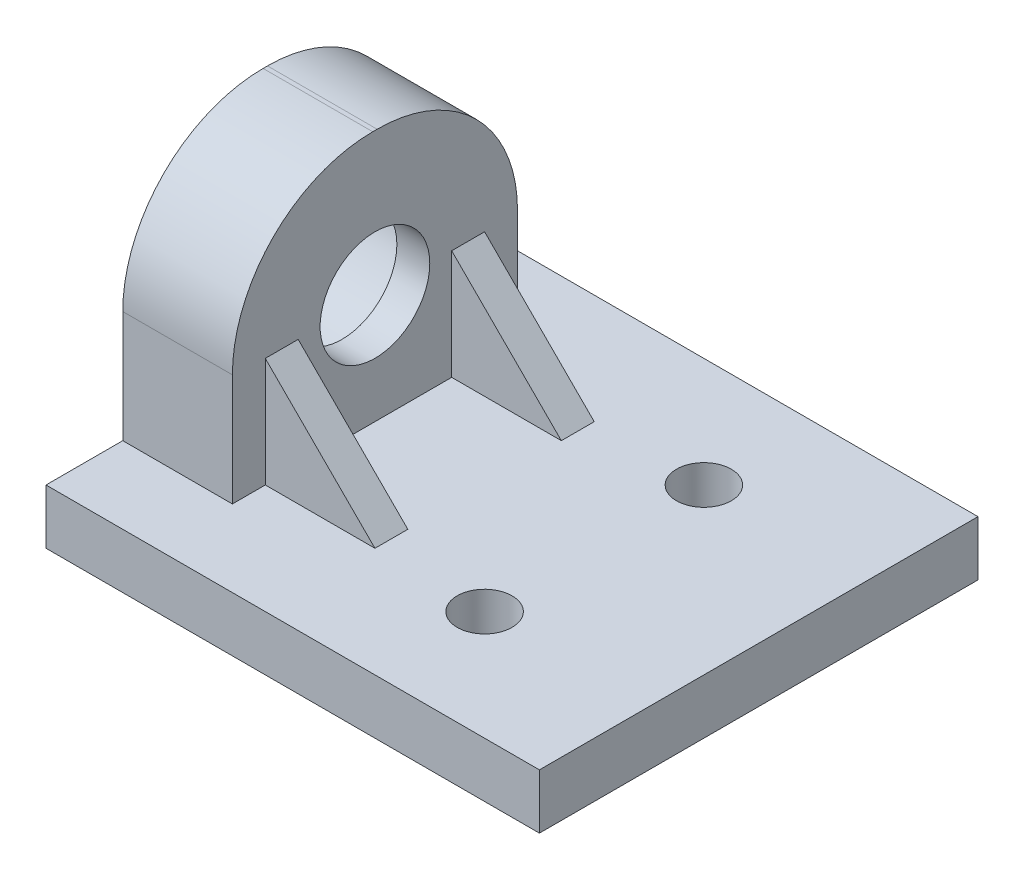
ISO-10303-21;
HEADER;
FILE_DESCRIPTION(('STEP AP214'),'2;1');
FILE_NAME('part.step','',(''),(''),'','','');
FILE_SCHEMA(('AUTOMOTIVE_DESIGN { 1 0 10303 214 1 1 1 1 }'));
ENDSEC;
DATA;
#1=APPLICATION_CONTEXT('core data for automotive mechanical design processes');
#2=APPLICATION_PROTOCOL_DEFINITION('international standard','automotive_design',2000,#1);
#3=PRODUCT_CONTEXT('',#1,'mechanical');
#4=PRODUCT('Part','Part','',(#3));
#5=PRODUCT_RELATED_PRODUCT_CATEGORY('part','',(#4));
#6=PRODUCT_DEFINITION_FORMATION('','',#4);
#7=PRODUCT_DEFINITION_CONTEXT('part definition',#1,'design');
#8=PRODUCT_DEFINITION('design','',#6,#7);
#9=PRODUCT_DEFINITION_SHAPE('','',#8);
#10=(LENGTH_UNIT() NAMED_UNIT(*) SI_UNIT(.MILLI.,.METRE.));
#11=(NAMED_UNIT(*) PLANE_ANGLE_UNIT() SI_UNIT($,.RADIAN.));
#12=(NAMED_UNIT(*) SI_UNIT($,.STERADIAN.) SOLID_ANGLE_UNIT());
#13=UNCERTAINTY_MEASURE_WITH_UNIT(LENGTH_MEASURE(1.E-05),#10,'distance_accuracy_value','');
#14=(GEOMETRIC_REPRESENTATION_CONTEXT(3) GLOBAL_UNCERTAINTY_ASSIGNED_CONTEXT((#13)) GLOBAL_UNIT_ASSIGNED_CONTEXT((#10,
#11,#12)) REPRESENTATION_CONTEXT('',''));
#15=CARTESIAN_POINT('',(0.,0.,0.));
#16=DIRECTION('',(0.,0.,1.));
#17=DIRECTION('',(1.,0.,0.));
#18=AXIS2_PLACEMENT_3D('',#15,#16,#17);
#19=CARTESIAN_POINT('',(0.,25.4,0.));
#20=DIRECTION('',(0.,-1.,0.));
#21=DIRECTION('',(0.,0.,-1.));
#22=AXIS2_PLACEMENT_3D('',#19,#20,#21);
#23=PLANE('',#22);
#24=CARTESIAN_POINT('',(38.1,25.4,-38.1));
#25=DIRECTION('',(0.,-1.,0.));
#26=DIRECTION('',(0.,0.,-1.));
#27=AXIS2_PLACEMENT_3D('',#24,#25,#26);
#28=CIRCLE('',#27,3.175);
#29=CARTESIAN_POINT('',(38.1,25.4,-41.275));
#30=VERTEX_POINT('',#29);
#31=EDGE_CURVE('E222',#30,#30,#28,.T.);
#32=ORIENTED_EDGE('',*,*,#31,.T.);
#33=EDGE_LOOP('',(#32));
#34=FACE_BOUND('',#33,.T.);
#35=CARTESIAN_POINT('',(38.1,25.4,-12.7));
#36=DIRECTION('',(0.,-1.,0.));
#37=DIRECTION('',(0.,0.,-1.));
#38=AXIS2_PLACEMENT_3D('',#35,#36,#37);
#39=CIRCLE('',#38,3.175);
#40=CARTESIAN_POINT('',(38.1,25.4,-15.875));
#41=VERTEX_POINT('',#40);
#42=EDGE_CURVE('E201',#41,#41,#39,.T.);
#43=ORIENTED_EDGE('',*,*,#42,.T.);
#44=EDGE_LOOP('',(#43));
#45=FACE_BOUND('',#44,.T.);
#46=DIRECTION('',(-1.,0.,0.));
#47=VECTOR('',#46,1.);
#48=CARTESIAN_POINT('',(0.,25.4,-50.8));
#49=LINE('',#48,#47);
#50=CARTESIAN_POINT('',(57.15,25.4,-50.8));
#51=VERTEX_POINT('',#50);
#52=CARTESIAN_POINT('',(0.,25.4,-50.8));
#53=VERTEX_POINT('',#52);
#54=EDGE_CURVE('E184',#51,#53,#49,.T.);
#55=ORIENTED_EDGE('',*,*,#54,.T.);
#56=DIRECTION('',(0.,0.,1.));
#57=VECTOR('',#56,1.);
#58=CARTESIAN_POINT('',(0.,25.4,0.));
#59=LINE('',#58,#57);
#60=CARTESIAN_POINT('',(0.,25.4,-41.91));
#61=VERTEX_POINT('',#60);
#62=EDGE_CURVE('E182',#53,#61,#59,.T.);
#63=ORIENTED_EDGE('',*,*,#62,.T.);
#64=DIRECTION('',(-1.,0.,0.));
#65=VECTOR('',#64,1.);
#66=CARTESIAN_POINT('',(12.7,25.4,-41.91));
#67=LINE('',#66,#65);
#68=CARTESIAN_POINT('',(12.7,25.4,-41.91));
#69=VERTEX_POINT('',#68);
#70=EDGE_CURVE('E265',#69,#61,#67,.T.);
#71=ORIENTED_EDGE('',*,*,#70,.F.);
#72=DIRECTION('',(0.,0.,1.));
#73=VECTOR('',#72,1.);
#74=CARTESIAN_POINT('',(12.7,25.4,-41.91));
#75=LINE('',#74,#73);
#76=CARTESIAN_POINT('',(12.7,25.4,-38.1));
#77=VERTEX_POINT('',#76);
#78=EDGE_CURVE('E244',#69,#77,#75,.T.);
#79=ORIENTED_EDGE('',*,*,#78,.T.);
#80=DIRECTION('',(-1.,0.,0.));
#81=VECTOR('',#80,1.);
#82=CARTESIAN_POINT('',(12.7,25.4,-38.1));
#83=LINE('',#82,#81);
#84=CARTESIAN_POINT('',(25.4,25.4,-38.1));
#85=VERTEX_POINT('',#84);
#86=EDGE_CURVE('E595',#85,#77,#83,.T.);
#87=ORIENTED_EDGE('',*,*,#86,.F.);
#88=DIRECTION('',(0.,0.,-1.));
#89=VECTOR('',#88,1.);
#90=CARTESIAN_POINT('',(25.4,25.4,-34.29));
#91=LINE('',#90,#89);
#92=CARTESIAN_POINT('',(25.4,25.4,-34.29));
#93=VERTEX_POINT('',#92);
#94=EDGE_CURVE('E598',#93,#85,#91,.T.);
#95=ORIENTED_EDGE('',*,*,#94,.F.);
#96=DIRECTION('',(1.,0.,0.));
#97=VECTOR('',#96,1.);
#98=CARTESIAN_POINT('',(12.7,25.4,-34.29));
#99=LINE('',#98,#97);
#100=CARTESIAN_POINT('',(12.7,25.4,-34.29));
#101=VERTEX_POINT('',#100);
#102=EDGE_CURVE('E577',#101,#93,#99,.T.);
#103=ORIENTED_EDGE('',*,*,#102,.F.);
#104=CARTESIAN_POINT('',(12.7,25.4,-16.51));
#105=VERTEX_POINT('',#104);
#106=EDGE_CURVE('E249',#101,#105,#75,.T.);
#107=ORIENTED_EDGE('',*,*,#106,.T.);
#108=DIRECTION('',(-1.,0.,0.));
#109=VECTOR('',#108,1.);
#110=CARTESIAN_POINT('',(12.7,25.4,-16.51));
#111=LINE('',#110,#109);
#112=CARTESIAN_POINT('',(25.4,25.4,-16.51));
#113=VERTEX_POINT('',#112);
#114=EDGE_CURVE('E563',#113,#105,#111,.T.);
#115=ORIENTED_EDGE('',*,*,#114,.F.);
#116=DIRECTION('',(0.,0.,-1.));
#117=VECTOR('',#116,1.);
#118=CARTESIAN_POINT('',(25.4,25.4,-16.51));
#119=LINE('',#118,#117);
#120=CARTESIAN_POINT('',(25.4,25.4,-12.7));
#121=VERTEX_POINT('',#120);
#122=EDGE_CURVE('E558',#121,#113,#119,.T.);
#123=ORIENTED_EDGE('',*,*,#122,.F.);
#124=DIRECTION('',(1.,0.,0.));
#125=VECTOR('',#124,1.);
#126=CARTESIAN_POINT('',(12.7,25.4,-12.7));
#127=LINE('',#126,#125);
#128=CARTESIAN_POINT('',(12.7,25.4,-12.7));
#129=VERTEX_POINT('',#128);
#130=EDGE_CURVE('E554',#129,#121,#127,.T.);
#131=ORIENTED_EDGE('',*,*,#130,.F.);
#132=CARTESIAN_POINT('',(12.7,25.4,-8.89));
#133=VERTEX_POINT('',#132);
#134=EDGE_CURVE('E242',#129,#133,#75,.T.);
#135=ORIENTED_EDGE('',*,*,#134,.T.);
#136=DIRECTION('',(-1.,0.,0.));
#137=VECTOR('',#136,1.);
#138=CARTESIAN_POINT('',(12.7,25.4,-8.89));
#139=LINE('',#138,#137);
#140=CARTESIAN_POINT('',(0.,25.4,-8.89));
#141=VERTEX_POINT('',#140);
#142=EDGE_CURVE('E295',#133,#141,#139,.T.);
#143=ORIENTED_EDGE('',*,*,#142,.T.);
#144=CARTESIAN_POINT('',(0.,25.4,0.));
#145=VERTEX_POINT('',#144);
#146=EDGE_CURVE('E305',#141,#145,#59,.T.);
#147=ORIENTED_EDGE('',*,*,#146,.T.);
#148=DIRECTION('',(1.,0.,0.));
#149=VECTOR('',#148,1.);
#150=CARTESIAN_POINT('',(0.,25.4,0.));
#151=LINE('',#150,#149);
#152=CARTESIAN_POINT('',(57.15,25.4,0.));
#153=VERTEX_POINT('',#152);
#154=EDGE_CURVE('E308',#145,#153,#151,.T.);
#155=ORIENTED_EDGE('',*,*,#154,.T.);
#156=DIRECTION('',(0.,0.,-1.));
#157=VECTOR('',#156,1.);
#158=CARTESIAN_POINT('',(57.15,25.4,0.));
#159=LINE('',#158,#157);
#160=EDGE_CURVE('E190',#153,#51,#159,.T.);
#161=ORIENTED_EDGE('',*,*,#160,.T.);
#162=EDGE_LOOP('',(#55,#63,#71,#79,#87,#95,#103,#107,#115,#123,#131,#135,#143,#147,#155,#161));
#163=FACE_BOUND('',#162,.T.);
#164=ADVANCED_FACE('F38',(#34,#45,#163),#23,.F.);
#165=CARTESIAN_POINT('',(12.7,38.354,-25.654));
#166=DIRECTION('',(1.,0.,0.));
#167=DIRECTION('',(0.,0.,-1.));
#168=AXIS2_PLACEMENT_3D('',#165,#166,#167);
#169=PLANE('',#168);
#170=CARTESIAN_POINT('',(12.7,38.1,-25.4));
#171=DIRECTION('',(1.,0.,0.));
#172=DIRECTION('',(0.,0.,-1.));
#173=AXIS2_PLACEMENT_3D('',#170,#171,#172);
#174=CIRCLE('',#173,6.35);
#175=CARTESIAN_POINT('',(12.7,38.1,-31.75));
#176=VERTEX_POINT('',#175);
#177=EDGE_CURVE('E226',#176,#176,#174,.T.);
#178=ORIENTED_EDGE('',*,*,#177,.F.);
#179=EDGE_LOOP('',(#178));
#180=FACE_BOUND('',#179,.T.);
#181=DIRECTION('',(0.,0.,1.));
#182=VECTOR('',#181,1.);
#183=CARTESIAN_POINT('',(12.7,38.1,-34.29));
#184=LINE('',#183,#182);
#185=CARTESIAN_POINT('',(12.7,38.1,-38.1));
#186=VERTEX_POINT('',#185);
#187=CARTESIAN_POINT('',(12.7,38.1,-34.29));
#188=VERTEX_POINT('',#187);
#189=EDGE_CURVE('E585',#186,#188,#184,.T.);
#190=ORIENTED_EDGE('',*,*,#189,.F.);
#191=DIRECTION('',(0.,-1.,0.));
#192=VECTOR('',#191,1.);
#193=CARTESIAN_POINT('',(12.7,38.1,-38.1));
#194=LINE('',#193,#192);
#195=EDGE_CURVE('E565',#186,#77,#194,.T.);
#196=ORIENTED_EDGE('',*,*,#195,.T.);
#197=ORIENTED_EDGE('',*,*,#78,.F.);
#198=DIRECTION('',(0.,-1.,0.));
#199=VECTOR('',#198,1.);
#200=CARTESIAN_POINT('',(12.7,25.4,-41.91));
#201=LINE('',#200,#199);
#202=CARTESIAN_POINT('',(12.7,38.3539999999999,-41.91));
#203=VERTEX_POINT('',#202);
#204=EDGE_CURVE('E239',#203,#69,#201,.T.);
#205=ORIENTED_EDGE('',*,*,#204,.F.);
#206=CARTESIAN_POINT('',(12.7,38.354,-25.654));
#207=DIRECTION('',(-1.,0.,0.));
#208=DIRECTION('',(0.,0.,-1.));
#209=AXIS2_PLACEMENT_3D('',#206,#207,#208);
#210=CIRCLE('',#209,16.256);
#211=CARTESIAN_POINT('',(12.7,54.61,-25.6539999999999));
#212=VERTEX_POINT('',#211);
#213=EDGE_CURVE('E261',#212,#203,#210,.T.);
#214=ORIENTED_EDGE('',*,*,#213,.F.);
#215=DIRECTION('',(0.,0.,-1.));
#216=VECTOR('',#215,1.);
#217=CARTESIAN_POINT('',(12.7,54.61,-25.6539999999999));
#218=LINE('',#217,#216);
#219=CARTESIAN_POINT('',(12.7,54.61,-25.1460000000001));
#220=VERTEX_POINT('',#219);
#221=EDGE_CURVE('E257',#220,#212,#218,.T.);
#222=ORIENTED_EDGE('',*,*,#221,.F.);
#223=CARTESIAN_POINT('',(12.7,38.354,-25.146));
#224=DIRECTION('',(-1.,0.,0.));
#225=DIRECTION('',(0.,0.,-1.));
#226=AXIS2_PLACEMENT_3D('',#223,#224,#225);
#227=CIRCLE('',#226,16.256);
#228=CARTESIAN_POINT('',(12.7,38.3539999999999,-8.89));
#229=VERTEX_POINT('',#228);
#230=EDGE_CURVE('E253',#229,#220,#227,.T.);
#231=ORIENTED_EDGE('',*,*,#230,.F.);
#232=DIRECTION('',(0.,1.,0.));
#233=VECTOR('',#232,1.);
#234=CARTESIAN_POINT('',(12.7,25.4,-8.89));
#235=LINE('',#234,#233);
#236=EDGE_CURVE('E248',#133,#229,#235,.T.);
#237=ORIENTED_EDGE('',*,*,#236,.F.);
#238=ORIENTED_EDGE('',*,*,#134,.F.);
#239=DIRECTION('',(0.,-1.,0.));
#240=VECTOR('',#239,1.);
#241=CARTESIAN_POINT('',(12.7,38.1,-12.7));
#242=LINE('',#241,#240);
#243=CARTESIAN_POINT('',(12.7,38.1,-12.7));
#244=VERTEX_POINT('',#243);
#245=EDGE_CURVE('E202',#244,#129,#242,.T.);
#246=ORIENTED_EDGE('',*,*,#245,.F.);
#247=DIRECTION('',(0.,0.,1.));
#248=VECTOR('',#247,1.);
#249=CARTESIAN_POINT('',(12.7,38.1,-16.51));
#250=LINE('',#249,#248);
#251=CARTESIAN_POINT('',(12.7,38.1,-16.51));
#252=VERTEX_POINT('',#251);
#253=EDGE_CURVE('E218',#252,#244,#250,.T.);
#254=ORIENTED_EDGE('',*,*,#253,.F.);
#255=DIRECTION('',(0.,-1.,0.));
#256=VECTOR('',#255,1.);
#257=CARTESIAN_POINT('',(12.7,38.1,-16.51));
#258=LINE('',#257,#256);
#259=EDGE_CURVE('E210',#252,#105,#258,.T.);
#260=ORIENTED_EDGE('',*,*,#259,.T.);
#261=ORIENTED_EDGE('',*,*,#106,.F.);
#262=DIRECTION('',(0.,-1.,0.));
#263=VECTOR('',#262,1.);
#264=CARTESIAN_POINT('',(12.7,38.1,-34.29));
#265=LINE('',#264,#263);
#266=EDGE_CURVE('E559',#188,#101,#265,.T.);
#267=ORIENTED_EDGE('',*,*,#266,.F.);
#268=EDGE_LOOP('',(#190,#196,#197,#205,#214,#222,#231,#237,#238,#246,#254,#260,#261,#267));
#269=FACE_BOUND('',#268,.T.);
#270=ADVANCED_FACE('F338',(#180,#269),#169,.T.);
#271=CARTESIAN_POINT('',(12.7,38.1,-25.4));
#272=DIRECTION('',(-1.,0.,0.));
#273=DIRECTION('',(0.,0.,1.));
#274=AXIS2_PLACEMENT_3D('',#271,#272,#273);
#275=CYLINDRICAL_SURFACE('',#274,10.9982);
#276=CARTESIAN_POINT('',(0.,38.1,-25.4));
#277=DIRECTION('',(-1.,0.,0.));
#278=DIRECTION('',(0.,0.,1.));
#279=AXIS2_PLACEMENT_3D('',#276,#277,#278);
#280=CIRCLE('',#279,10.9982);
#281=CARTESIAN_POINT('',(0.,38.1,-14.4018));
#282=VERTEX_POINT('',#281);
#283=EDGE_CURVE('E231',#282,#282,#280,.T.);
#284=ORIENTED_EDGE('',*,*,#283,.T.);
#285=EDGE_LOOP('',(#284));
#286=FACE_BOUND('',#285,.T.);
#287=CARTESIAN_POINT('',(8.89,38.1,-25.4));
#288=DIRECTION('',(1.,0.,0.));
#289=DIRECTION('',(0.,0.,-1.));
#290=AXIS2_PLACEMENT_3D('',#287,#288,#289);
#291=CIRCLE('',#290,10.9982);
#292=CARTESIAN_POINT('',(8.89,38.1,-36.3982));
#293=VERTEX_POINT('',#292);
#294=EDGE_CURVE('E11',#293,#293,#291,.F.);
#295=ORIENTED_EDGE('',*,*,#294,.F.);
#296=EDGE_LOOP('',(#295));
#297=FACE_BOUND('',#296,.T.);
#298=ADVANCED_FACE('F358',(#286,#297),#275,.F.);
#299=CARTESIAN_POINT('',(0.,25.4,0.));
#300=DIRECTION('',(1.,0.,0.));
#301=DIRECTION('',(0.,0.,-1.));
#302=AXIS2_PLACEMENT_3D('',#299,#300,#301);
#303=PLANE('',#302);
#304=DIRECTION('',(0.,-1.,0.));
#305=VECTOR('',#304,1.);
#306=CARTESIAN_POINT('',(0.,25.4,-50.8));
#307=LINE('',#306,#305);
#308=CARTESIAN_POINT('',(0.,19.05,-50.8));
#309=VERTEX_POINT('',#308);
#310=EDGE_CURVE('E159',#53,#309,#307,.T.);
#311=ORIENTED_EDGE('',*,*,#310,.T.);
#312=DIRECTION('',(0.,0.,1.));
#313=VECTOR('',#312,1.);
#314=CARTESIAN_POINT('',(0.,19.05,-50.8));
#315=LINE('',#314,#313);
#316=CARTESIAN_POINT('',(0.,19.05,0.));
#317=VERTEX_POINT('',#316);
#318=EDGE_CURVE('E170',#309,#317,#315,.T.);
#319=ORIENTED_EDGE('',*,*,#318,.T.);
#320=DIRECTION('',(0.,-1.,0.));
#321=VECTOR('',#320,1.);
#322=CARTESIAN_POINT('',(0.,25.4,0.));
#323=LINE('',#322,#321);
#324=EDGE_CURVE('E48',#145,#317,#323,.T.);
#325=ORIENTED_EDGE('',*,*,#324,.F.);
#326=ORIENTED_EDGE('',*,*,#146,.F.);
#327=DIRECTION('',(0.,1.,0.));
#328=VECTOR('',#327,1.);
#329=CARTESIAN_POINT('',(0.,25.4,-8.89));
#330=LINE('',#329,#328);
#331=CARTESIAN_POINT('',(0.,38.3539999999999,-8.89));
#332=VERTEX_POINT('',#331);
#333=EDGE_CURVE('E268',#141,#332,#330,.T.);
#334=ORIENTED_EDGE('',*,*,#333,.T.);
#335=CARTESIAN_POINT('',(0.,38.354,-25.146));
#336=DIRECTION('',(-1.,0.,0.));
#337=DIRECTION('',(0.,0.,-1.));
#338=AXIS2_PLACEMENT_3D('',#335,#336,#337);
#339=CIRCLE('',#338,16.256);
#340=CARTESIAN_POINT('',(0.,54.61,-25.1460000000001));
#341=VERTEX_POINT('',#340);
#342=EDGE_CURVE('E272',#332,#341,#339,.T.);
#343=ORIENTED_EDGE('',*,*,#342,.T.);
#344=DIRECTION('',(0.,0.,-1.));
#345=VECTOR('',#344,1.);
#346=CARTESIAN_POINT('',(0.,54.61,-25.6539999999999));
#347=LINE('',#346,#345);
#348=CARTESIAN_POINT('',(0.,54.61,-25.6539999999999));
#349=VERTEX_POINT('',#348);
#350=EDGE_CURVE('E276',#341,#349,#347,.T.);
#351=ORIENTED_EDGE('',*,*,#350,.T.);
#352=CARTESIAN_POINT('',(0.,38.354,-25.654));
#353=DIRECTION('',(-1.,0.,0.));
#354=DIRECTION('',(0.,0.,-1.));
#355=AXIS2_PLACEMENT_3D('',#352,#353,#354);
#356=CIRCLE('',#355,16.256);
#357=CARTESIAN_POINT('',(0.,38.3539999999999,-41.91));
#358=VERTEX_POINT('',#357);
#359=EDGE_CURVE('E243',#349,#358,#356,.T.);
#360=ORIENTED_EDGE('',*,*,#359,.T.);
#361=DIRECTION('',(0.,-1.,0.));
#362=VECTOR('',#361,1.);
#363=CARTESIAN_POINT('',(0.,25.4,-41.91));
#364=LINE('',#363,#362);
#365=EDGE_CURVE('E238',#358,#61,#364,.T.);
#366=ORIENTED_EDGE('',*,*,#365,.T.);
#367=ORIENTED_EDGE('',*,*,#62,.F.);
#368=EDGE_LOOP('',(#311,#319,#325,#326,#334,#343,#351,#360,#366,#367));
#369=FACE_BOUND('',#368,.T.);
#370=ORIENTED_EDGE('',*,*,#283,.F.);
#371=EDGE_LOOP('',(#370));
#372=FACE_BOUND('',#371,.T.);
#373=ADVANCED_FACE('F40',(#369,#372),#303,.F.);
#374=CARTESIAN_POINT('',(0.,25.4,0.));
#375=DIRECTION('',(0.,0.,-1.));
#376=DIRECTION('',(-1.,0.,0.));
#377=AXIS2_PLACEMENT_3D('',#374,#375,#376);
#378=PLANE('',#377);
#379=ORIENTED_EDGE('',*,*,#324,.T.);
#380=DIRECTION('',(-1.,0.,0.));
#381=VECTOR('',#380,1.);
#382=CARTESIAN_POINT('',(57.15,19.05,0.));
#383=LINE('',#382,#381);
#384=CARTESIAN_POINT('',(57.15,19.05,0.));
#385=VERTEX_POINT('',#384);
#386=EDGE_CURVE('E167',#385,#317,#383,.T.);
#387=ORIENTED_EDGE('',*,*,#386,.F.);
#388=DIRECTION('',(0.,-1.,0.));
#389=VECTOR('',#388,1.);
#390=CARTESIAN_POINT('',(57.15,25.4,0.));
#391=LINE('',#390,#389);
#392=EDGE_CURVE('E188',#153,#385,#391,.T.);
#393=ORIENTED_EDGE('',*,*,#392,.F.);
#394=ORIENTED_EDGE('',*,*,#154,.F.);
#395=EDGE_LOOP('',(#379,#387,#393,#394));
#396=FACE_BOUND('',#395,.T.);
#397=ADVANCED_FACE('F318',(#396),#378,.F.);
#398=CARTESIAN_POINT('',(57.15,25.4,0.));
#399=DIRECTION('',(-1.,0.,0.));
#400=DIRECTION('',(0.,0.,1.));
#401=AXIS2_PLACEMENT_3D('',#398,#399,#400);
#402=PLANE('',#401);
#403=ORIENTED_EDGE('',*,*,#392,.T.);
#404=DIRECTION('',(0.,0.,1.));
#405=VECTOR('',#404,1.);
#406=CARTESIAN_POINT('',(57.15,19.05,-50.8));
#407=LINE('',#406,#405);
#408=CARTESIAN_POINT('',(57.15,19.05,-50.8));
#409=VERTEX_POINT('',#408);
#410=EDGE_CURVE('E166',#409,#385,#407,.T.);
#411=ORIENTED_EDGE('',*,*,#410,.F.);
#412=DIRECTION('',(0.,-1.,0.));
#413=VECTOR('',#412,1.);
#414=CARTESIAN_POINT('',(57.15,25.4,-50.8));
#415=LINE('',#414,#413);
#416=EDGE_CURVE('E162',#51,#409,#415,.T.);
#417=ORIENTED_EDGE('',*,*,#416,.F.);
#418=ORIENTED_EDGE('',*,*,#160,.F.);
#419=EDGE_LOOP('',(#403,#411,#417,#418));
#420=FACE_BOUND('',#419,.T.);
#421=ADVANCED_FACE('F316',(#420),#402,.F.);
#422=CARTESIAN_POINT('',(0.,25.4,-50.8));
#423=DIRECTION('',(0.,0.,1.));
#424=DIRECTION('',(1.,0.,0.));
#425=AXIS2_PLACEMENT_3D('',#422,#423,#424);
#426=PLANE('',#425);
#427=DIRECTION('',(-1.,0.,0.));
#428=VECTOR('',#427,1.);
#429=CARTESIAN_POINT('',(57.15,19.05,-50.8));
#430=LINE('',#429,#428);
#431=EDGE_CURVE('E154',#409,#309,#430,.T.);
#432=ORIENTED_EDGE('',*,*,#431,.T.);
#433=ORIENTED_EDGE('',*,*,#310,.F.);
#434=ORIENTED_EDGE('',*,*,#54,.F.);
#435=ORIENTED_EDGE('',*,*,#416,.T.);
#436=EDGE_LOOP('',(#432,#433,#434,#435));
#437=FACE_BOUND('',#436,.T.);
#438=ADVANCED_FACE('F156',(#437),#426,.F.);
#439=CARTESIAN_POINT('',(57.15,19.05,-50.8));
#440=DIRECTION('',(0.,1.,0.));
#441=DIRECTION('',(-1.,0.,0.));
#442=AXIS2_PLACEMENT_3D('',#439,#440,#441);
#443=PLANE('',#442);
#444=CARTESIAN_POINT('',(38.1,19.05,-38.1));
#445=DIRECTION('',(0.,1.,0.));
#446=DIRECTION('',(-1.,0.,0.));
#447=AXIS2_PLACEMENT_3D('',#444,#445,#446);
#448=CIRCLE('',#447,3.175);
#449=CARTESIAN_POINT('',(34.925,19.05,-38.1));
#450=VERTEX_POINT('',#449);
#451=EDGE_CURVE('E42',#450,#450,#448,.T.);
#452=ORIENTED_EDGE('',*,*,#451,.T.);
#453=EDGE_LOOP('',(#452));
#454=FACE_BOUND('',#453,.T.);
#455=CARTESIAN_POINT('',(38.1,19.05,-12.7));
#456=DIRECTION('',(0.,1.,0.));
#457=DIRECTION('',(-1.,0.,0.));
#458=AXIS2_PLACEMENT_3D('',#455,#456,#457);
#459=CIRCLE('',#458,3.175);
#460=CARTESIAN_POINT('',(34.925,19.05,-12.7));
#461=VERTEX_POINT('',#460);
#462=EDGE_CURVE('E198',#461,#461,#459,.T.);
#463=ORIENTED_EDGE('',*,*,#462,.T.);
#464=EDGE_LOOP('',(#463));
#465=FACE_BOUND('',#464,.T.);
#466=ORIENTED_EDGE('',*,*,#386,.T.);
#467=ORIENTED_EDGE('',*,*,#318,.F.);
#468=ORIENTED_EDGE('',*,*,#431,.F.);
#469=ORIENTED_EDGE('',*,*,#410,.T.);
#470=EDGE_LOOP('',(#466,#467,#468,#469));
#471=FACE_BOUND('',#470,.T.);
#472=ADVANCED_FACE('F171',(#454,#465,#471),#443,.F.);
#473=CARTESIAN_POINT('',(12.7,25.4,-41.91));
#474=DIRECTION('',(0.,0.,-1.));
#475=DIRECTION('',(-1.,0.,0.));
#476=AXIS2_PLACEMENT_3D('',#473,#474,#475);
#477=PLANE('',#476);
#478=ORIENTED_EDGE('',*,*,#365,.F.);
#479=DIRECTION('',(-1.,0.,0.));
#480=VECTOR('',#479,1.);
#481=CARTESIAN_POINT('',(12.7,38.3539999999999,-41.91));
#482=LINE('',#481,#480);
#483=EDGE_CURVE('E283',#203,#358,#482,.T.);
#484=ORIENTED_EDGE('',*,*,#483,.F.);
#485=ORIENTED_EDGE('',*,*,#204,.T.);
#486=ORIENTED_EDGE('',*,*,#70,.T.);
#487=EDGE_LOOP('',(#478,#484,#485,#486));
#488=FACE_BOUND('',#487,.T.);
#489=ADVANCED_FACE('F369',(#488),#477,.T.);
#490=CARTESIAN_POINT('',(12.7,38.354,-25.654));
#491=DIRECTION('',(-1.,0.,0.));
#492=DIRECTION('',(0.,0.,1.));
#493=AXIS2_PLACEMENT_3D('',#490,#491,#492);
#494=CYLINDRICAL_SURFACE('',#493,16.256);
#495=ORIENTED_EDGE('',*,*,#359,.F.);
#496=DIRECTION('',(-1.,0.,0.));
#497=VECTOR('',#496,1.);
#498=CARTESIAN_POINT('',(12.7,54.61,-25.6539999999999));
#499=LINE('',#498,#497);
#500=EDGE_CURVE('E286',#212,#349,#499,.T.);
#501=ORIENTED_EDGE('',*,*,#500,.F.);
#502=ORIENTED_EDGE('',*,*,#213,.T.);
#503=ORIENTED_EDGE('',*,*,#483,.T.);
#504=EDGE_LOOP('',(#495,#501,#502,#503));
#505=FACE_BOUND('',#504,.T.);
#506=ADVANCED_FACE('F365',(#505),#494,.T.);
#507=CARTESIAN_POINT('',(12.7,54.61,-25.6539999999999));
#508=DIRECTION('',(0.,1.,0.));
#509=DIRECTION('',(0.,0.,1.));
#510=AXIS2_PLACEMENT_3D('',#507,#508,#509);
#511=PLANE('',#510);
#512=ORIENTED_EDGE('',*,*,#350,.F.);
#513=DIRECTION('',(-1.,0.,0.));
#514=VECTOR('',#513,1.);
#515=CARTESIAN_POINT('',(12.7,54.61,-25.1460000000001));
#516=LINE('',#515,#514);
#517=EDGE_CURVE('E289',#220,#341,#516,.T.);
#518=ORIENTED_EDGE('',*,*,#517,.F.);
#519=ORIENTED_EDGE('',*,*,#221,.T.);
#520=ORIENTED_EDGE('',*,*,#500,.T.);
#521=EDGE_LOOP('',(#512,#518,#519,#520));
#522=FACE_BOUND('',#521,.T.);
#523=ADVANCED_FACE('F368',(#522),#511,.T.);
#524=CARTESIAN_POINT('',(12.7,38.354,-25.146));
#525=DIRECTION('',(-1.,0.,0.));
#526=DIRECTION('',(0.,0.,1.));
#527=AXIS2_PLACEMENT_3D('',#524,#525,#526);
#528=CYLINDRICAL_SURFACE('',#527,16.256);
#529=ORIENTED_EDGE('',*,*,#342,.F.);
#530=DIRECTION('',(-1.,0.,0.));
#531=VECTOR('',#530,1.);
#532=CARTESIAN_POINT('',(12.7,38.3539999999999,-8.89));
#533=LINE('',#532,#531);
#534=EDGE_CURVE('E292',#229,#332,#533,.T.);
#535=ORIENTED_EDGE('',*,*,#534,.F.);
#536=ORIENTED_EDGE('',*,*,#230,.T.);
#537=ORIENTED_EDGE('',*,*,#517,.T.);
#538=EDGE_LOOP('',(#529,#535,#536,#537));
#539=FACE_BOUND('',#538,.T.);
#540=ADVANCED_FACE('F373',(#539),#528,.T.);
#541=CARTESIAN_POINT('',(12.7,25.4,-8.89));
#542=DIRECTION('',(0.,0.,1.));
#543=DIRECTION('',(1.,0.,0.));
#544=AXIS2_PLACEMENT_3D('',#541,#542,#543);
#545=PLANE('',#544);
#546=ORIENTED_EDGE('',*,*,#333,.F.);
#547=ORIENTED_EDGE('',*,*,#142,.F.);
#548=ORIENTED_EDGE('',*,*,#236,.T.);
#549=ORIENTED_EDGE('',*,*,#534,.T.);
#550=EDGE_LOOP('',(#546,#547,#548,#549));
#551=FACE_BOUND('',#550,.T.);
#552=ADVANCED_FACE('F356',(#551),#545,.T.);
#553=CARTESIAN_POINT('',(8.89,38.1,-25.4));
#554=DIRECTION('',(1.,0.,0.));
#555=DIRECTION('',(0.,0.,-1.));
#556=AXIS2_PLACEMENT_3D('',#553,#554,#555);
#557=PLANE('',#556);
#558=CARTESIAN_POINT('',(8.89,38.1,-25.4));
#559=DIRECTION('',(1.,0.,0.));
#560=DIRECTION('',(0.,0.,-1.));
#561=AXIS2_PLACEMENT_3D('',#558,#559,#560);
#562=CIRCLE('',#561,6.35);
#563=CARTESIAN_POINT('',(8.89,38.1,-31.75));
#564=VERTEX_POINT('',#563);
#565=EDGE_CURVE('E227',#564,#564,#562,.T.);
#566=ORIENTED_EDGE('',*,*,#565,.T.);
#567=EDGE_LOOP('',(#566));
#568=FACE_BOUND('',#567,.T.);
#569=ORIENTED_EDGE('',*,*,#294,.T.);
#570=EDGE_LOOP('',(#569));
#571=FACE_BOUND('',#570,.T.);
#572=ADVANCED_FACE('F349',(#568,#571),#557,.F.);
#573=CARTESIAN_POINT('',(8.89,38.1,-25.4));
#574=DIRECTION('',(1.,0.,0.));
#575=DIRECTION('',(0.,0.,-1.));
#576=AXIS2_PLACEMENT_3D('',#573,#574,#575);
#577=CYLINDRICAL_SURFACE('',#576,6.35);
#578=CARTESIAN_POINT('',(8.89,38.1,-31.75));
#579=CARTESIAN_POINT('',(8.9296875,38.1,-31.75));
#580=CARTESIAN_POINT('',(8.969375,38.1,-31.75));
#581=CARTESIAN_POINT('',(9.04875,38.1,-31.75));
#582=CARTESIAN_POINT('',(9.0884375,38.1,-31.75));
#583=CARTESIAN_POINT('',(9.1678125,38.1,-31.75));
#584=CARTESIAN_POINT('',(9.2075,38.1,-31.75));
#585=CARTESIAN_POINT('',(9.286875,38.1,-31.75));
#586=CARTESIAN_POINT('',(9.3265625,38.1,-31.75));
#587=CARTESIAN_POINT('',(9.4059375,38.1,-31.75));
#588=CARTESIAN_POINT('',(9.445625,38.1,-31.75));
#589=CARTESIAN_POINT('',(9.525,38.1,-31.75));
#590=CARTESIAN_POINT('',(9.5646875,38.1,-31.75));
#591=CARTESIAN_POINT('',(9.6440625,38.1,-31.75));
#592=CARTESIAN_POINT('',(9.68375,38.1,-31.75));
#593=CARTESIAN_POINT('',(9.763125,38.1,-31.75));
#594=CARTESIAN_POINT('',(9.8028125,38.1,-31.75));
#595=CARTESIAN_POINT('',(9.8821875,38.1,-31.75));
#596=CARTESIAN_POINT('',(9.921875,38.1,-31.75));
#597=CARTESIAN_POINT('',(10.00125,38.1,-31.75));
#598=CARTESIAN_POINT('',(10.0409375,38.1,-31.75));
#599=CARTESIAN_POINT('',(10.1203125,38.1,-31.75));
#600=CARTESIAN_POINT('',(10.16,38.1,-31.75));
#601=CARTESIAN_POINT('',(10.239375,38.1,-31.75));
#602=CARTESIAN_POINT('',(10.2790625,38.1,-31.75));
#603=CARTESIAN_POINT('',(10.3584375,38.1,-31.75));
#604=CARTESIAN_POINT('',(10.398125,38.1,-31.75));
#605=CARTESIAN_POINT('',(10.4775,38.1,-31.75));
#606=CARTESIAN_POINT('',(10.5171875,38.1,-31.75));
#607=CARTESIAN_POINT('',(10.5965625,38.1,-31.75));
#608=CARTESIAN_POINT('',(10.63625,38.1,-31.75));
#609=CARTESIAN_POINT('',(10.715625,38.1,-31.75));
#610=CARTESIAN_POINT('',(10.7553125,38.1,-31.75));
#611=CARTESIAN_POINT('',(10.8346875,38.1,-31.75));
#612=CARTESIAN_POINT('',(10.874375,38.1,-31.75));
#613=CARTESIAN_POINT('',(10.95375,38.1,-31.75));
#614=CARTESIAN_POINT('',(10.9934375,38.1,-31.75));
#615=CARTESIAN_POINT('',(11.0728125,38.1,-31.75));
#616=CARTESIAN_POINT('',(11.1125,38.1,-31.75));
#617=CARTESIAN_POINT('',(11.191875,38.1,-31.75));
#618=CARTESIAN_POINT('',(11.2315625,38.1,-31.75));
#619=CARTESIAN_POINT('',(11.3109375,38.1,-31.75));
#620=CARTESIAN_POINT('',(11.350625,38.1,-31.75));
#621=CARTESIAN_POINT('',(11.43,38.1,-31.75));
#622=CARTESIAN_POINT('',(11.4696875,38.1,-31.75));
#623=CARTESIAN_POINT('',(11.5490625,38.1,-31.75));
#624=CARTESIAN_POINT('',(11.58875,38.1,-31.75));
#625=CARTESIAN_POINT('',(11.668125,38.1,-31.75));
#626=CARTESIAN_POINT('',(11.7078125,38.1,-31.75));
#627=CARTESIAN_POINT('',(11.7871875,38.1,-31.75));
#628=CARTESIAN_POINT('',(11.826875,38.1,-31.75));
#629=CARTESIAN_POINT('',(11.90625,38.1,-31.75));
#630=CARTESIAN_POINT('',(11.9459375,38.1,-31.75));
#631=CARTESIAN_POINT('',(12.0253125,38.1,-31.75));
#632=CARTESIAN_POINT('',(12.065,38.1,-31.75));
#633=CARTESIAN_POINT('',(12.144375,38.1,-31.75));
#634=CARTESIAN_POINT('',(12.1840625,38.1,-31.75));
#635=CARTESIAN_POINT('',(12.2634375,38.1,-31.75));
#636=CARTESIAN_POINT('',(12.303125,38.1,-31.75));
#637=CARTESIAN_POINT('',(12.3825,38.1,-31.75));
#638=CARTESIAN_POINT('',(12.4221875,38.1,-31.75));
#639=CARTESIAN_POINT('',(12.5015625,38.1,-31.75));
#640=CARTESIAN_POINT('',(12.54125,38.1,-31.75));
#641=CARTESIAN_POINT('',(12.620625,38.1,-31.75));
#642=CARTESIAN_POINT('',(12.6603125,38.1,-31.75));
#643=CARTESIAN_POINT('',(12.7,38.1,-31.75));
#644=B_SPLINE_CURVE_WITH_KNOTS('',3,(#578,#579,#580,#581,#582,#583,#584,#585,#586,#587,#588,
#589,#590,#591,#592,#593,#594,#595,#596,#597,#598,#599,#600,#601,#602,#603,#604,#605,#606,#607,
#608,#609,#610,#611,#612,#613,#614,#615,#616,#617,#618,#619,#620,#621,#622,#623,#624,#625,#626,
#627,#628,#629,#630,#631,#632,#633,#634,#635,#636,#637,#638,#639,#640,#641,#642,#643),
.UNSPECIFIED.,.F.,.F.,(4,2,2,2,2,2,2,2,2,2,2,2,2,2,2,2,2,2,2,2,2,2,2,2,2,2,2,2,2,2,2,2,4),(0.,
0.119062500000001,0.238125,0.357187500000002,0.476250000000001,0.5953125,0.714375,
0.833437500000001,0.9525,1.0715625,1.190625,1.3096875,1.42875,1.5478125,1.666875,1.7859375,
1.905,2.0240625,2.143125,2.2621875,2.38125,2.5003125,2.619375,2.7384375,2.8575,2.9765625,
3.095625,3.2146875,3.33375,3.4528125,3.571875,3.6909375,3.81),.UNSPECIFIED.);
#645=EDGE_CURVE('BSEAM343',#564,#176,#644,.T.);
#646=ORIENTED_EDGE('',*,*,#565,.F.);
#647=ORIENTED_EDGE('',*,*,#177,.T.);
#648=ORIENTED_EDGE('',*,*,#645,.T.);
#649=ORIENTED_EDGE('',*,*,#645,.F.);
#650=EDGE_LOOP('',(#646,#648,#647,#649));
#651=FACE_BOUND('',#650,.T.);
#652=ADVANCED_FACE('F343',(#651),#577,.F.);
#653=CARTESIAN_POINT('',(38.1,54.61,-12.7));
#654=DIRECTION('',(0.,-1.,0.));
#655=DIRECTION('',(0.,0.,-1.));
#656=AXIS2_PLACEMENT_3D('',#653,#654,#655);
#657=CYLINDRICAL_SURFACE('',#656,3.175);
#658=ORIENTED_EDGE('',*,*,#462,.F.);
#659=EDGE_LOOP('',(#658));
#660=FACE_BOUND('',#659,.T.);
#661=ORIENTED_EDGE('',*,*,#42,.F.);
#662=EDGE_LOOP('',(#661));
#663=FACE_BOUND('',#662,.T.);
#664=ADVANCED_FACE('F332',(#660,#663),#657,.F.);
#665=CARTESIAN_POINT('',(38.1,54.61,-38.1));
#666=DIRECTION('',(0.,-1.,0.));
#667=DIRECTION('',(0.,0.,-1.));
#668=AXIS2_PLACEMENT_3D('',#665,#666,#667);
#669=CYLINDRICAL_SURFACE('',#668,3.175);
#670=ORIENTED_EDGE('',*,*,#451,.F.);
#671=EDGE_LOOP('',(#670));
#672=FACE_BOUND('',#671,.T.);
#673=ORIENTED_EDGE('',*,*,#31,.F.);
#674=EDGE_LOOP('',(#673));
#675=FACE_BOUND('',#674,.T.);
#676=ADVANCED_FACE('F328',(#672,#675),#669,.F.);
#677=CARTESIAN_POINT('',(12.7,38.1,-12.7));
#678=DIRECTION('',(0.,0.,-1.));
#679=DIRECTION('',(-1.,0.,0.));
#680=AXIS2_PLACEMENT_3D('',#677,#678,#679);
#681=PLANE('',#680);
#682=ORIENTED_EDGE('',*,*,#130,.T.);
#683=DIRECTION('',(0.707106781186548,-0.707106781186547,0.));
#684=VECTOR('',#683,1.);
#685=CARTESIAN_POINT('',(12.7,38.1,-12.7));
#686=LINE('',#685,#684);
#687=EDGE_CURVE('E177',#244,#121,#686,.T.);
#688=ORIENTED_EDGE('',*,*,#687,.F.);
#689=ORIENTED_EDGE('',*,*,#245,.T.);
#690=EDGE_LOOP('',(#682,#688,#689));
#691=FACE_BOUND('',#690,.T.);
#692=ADVANCED_FACE('F331',(#691),#681,.F.);
#693=CARTESIAN_POINT('',(12.7,38.1,-16.51));
#694=DIRECTION('',(0.,0.,1.));
#695=DIRECTION('',(1.,0.,0.));
#696=AXIS2_PLACEMENT_3D('',#693,#694,#695);
#697=PLANE('',#696);
#698=ORIENTED_EDGE('',*,*,#259,.F.);
#699=DIRECTION('',(0.707106781186548,-0.707106781186547,0.));
#700=VECTOR('',#699,1.);
#701=CARTESIAN_POINT('',(12.7,38.1,-16.51));
#702=LINE('',#701,#700);
#703=EDGE_CURVE('E64',#252,#113,#702,.T.);
#704=ORIENTED_EDGE('',*,*,#703,.T.);
#705=ORIENTED_EDGE('',*,*,#114,.T.);
#706=EDGE_LOOP('',(#698,#704,#705));
#707=FACE_BOUND('',#706,.T.);
#708=ADVANCED_FACE('F431',(#707),#697,.F.);
#709=CARTESIAN_POINT('',(12.7,38.1,-34.29));
#710=DIRECTION('',(0.,0.,-1.));
#711=DIRECTION('',(-1.,0.,0.));
#712=AXIS2_PLACEMENT_3D('',#709,#710,#711);
#713=PLANE('',#712);
#714=ORIENTED_EDGE('',*,*,#102,.T.);
#715=DIRECTION('',(-0.707106781186548,0.707106781186547,0.));
#716=VECTOR('',#715,1.);
#717=CARTESIAN_POINT('',(12.7,38.1,-34.29));
#718=LINE('',#717,#716);
#719=EDGE_CURVE('E578',#93,#188,#718,.T.);
#720=ORIENTED_EDGE('',*,*,#719,.T.);
#721=ORIENTED_EDGE('',*,*,#266,.T.);
#722=EDGE_LOOP('',(#714,#720,#721));
#723=FACE_BOUND('',#722,.T.);
#724=ADVANCED_FACE('F421',(#723),#713,.F.);
#725=CARTESIAN_POINT('',(12.7,38.1,-38.1));
#726=DIRECTION('',(0.,0.,1.));
#727=DIRECTION('',(1.,0.,0.));
#728=AXIS2_PLACEMENT_3D('',#725,#726,#727);
#729=PLANE('',#728);
#730=ORIENTED_EDGE('',*,*,#195,.F.);
#731=DIRECTION('',(0.707106781186548,-0.707106781186547,0.));
#732=VECTOR('',#731,1.);
#733=CARTESIAN_POINT('',(12.7,38.1,-38.1));
#734=LINE('',#733,#732);
#735=EDGE_CURVE('E56',#186,#85,#734,.T.);
#736=ORIENTED_EDGE('',*,*,#735,.T.);
#737=ORIENTED_EDGE('',*,*,#86,.T.);
#738=EDGE_LOOP('',(#730,#736,#737));
#739=FACE_BOUND('',#738,.T.);
#740=ADVANCED_FACE('F413',(#739),#729,.F.);
#741=CARTESIAN_POINT('',(12.7,38.1,-50.8));
#742=DIRECTION('',(-0.707106781186547,-0.707106781186548,0.));
#743=DIRECTION('',(0.707106781186548,-0.707106781186547,0.));
#744=AXIS2_PLACEMENT_3D('',#741,#742,#743);
#745=PLANE('',#744);
#746=ORIENTED_EDGE('',*,*,#94,.T.);
#747=ORIENTED_EDGE('',*,*,#735,.F.);
#748=ORIENTED_EDGE('',*,*,#189,.T.);
#749=ORIENTED_EDGE('',*,*,#719,.F.);
#750=EDGE_LOOP('',(#746,#747,#748,#749));
#751=FACE_BOUND('',#750,.T.);
#752=ADVANCED_FACE('F403',(#751),#745,.F.);
#753=ORIENTED_EDGE('',*,*,#253,.T.);
#754=ORIENTED_EDGE('',*,*,#687,.T.);
#755=ORIENTED_EDGE('',*,*,#122,.T.);
#756=ORIENTED_EDGE('',*,*,#703,.F.);
#757=EDGE_LOOP('',(#753,#754,#755,#756));
#758=FACE_BOUND('',#757,.T.);
#759=ADVANCED_FACE('F398',(#758),#745,.F.);
#760=CLOSED_SHELL('',(#164,#270,#298,#373,#397,#421,#438,#472,#489,#506,#523,#540,#552,#572,
#652,#664,#676,#692,#708,#724,#740,#752,#759));
#761=MANIFOLD_SOLID_BREP('B2',#760);
#762=ADVANCED_BREP_SHAPE_REPRESENTATION('',(#18,#761),#14);
#763=SHAPE_DEFINITION_REPRESENTATION(#9,#762);
ENDSEC;
END-ISO-10303-21;
